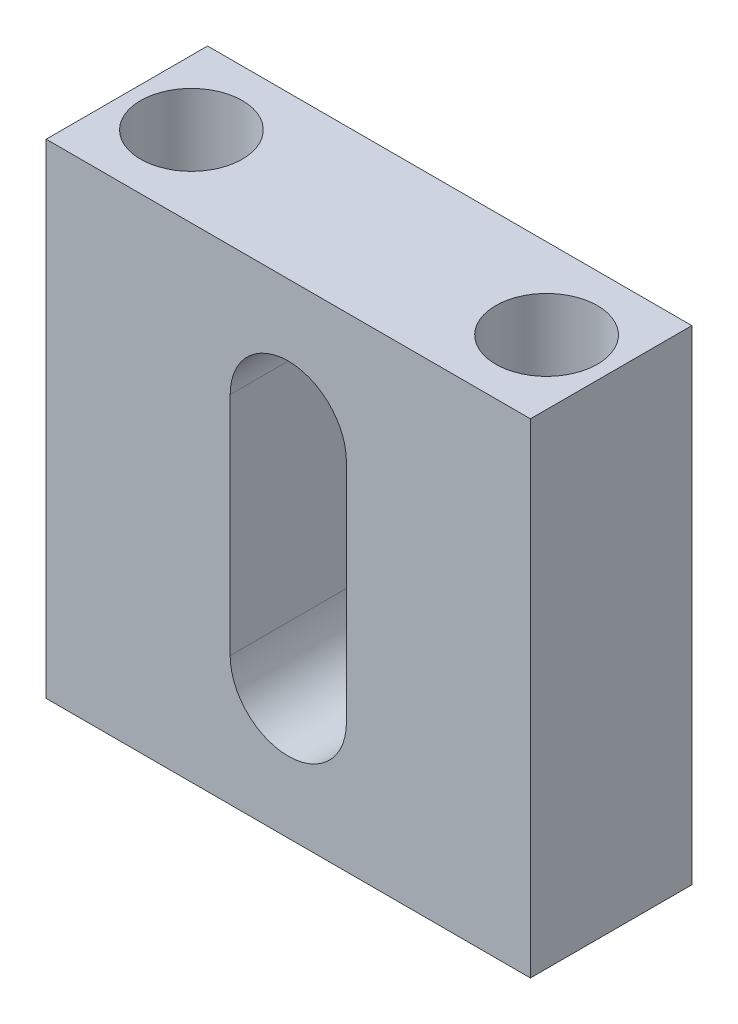
ISO-10303-21;
HEADER;
FILE_DESCRIPTION(('STEP AP214'),'2;1');
FILE_NAME('part.step','',(''),(''),'','','');
FILE_SCHEMA(('AUTOMOTIVE_DESIGN { 1 0 10303 214 1 1 1 1 }'));
ENDSEC;
DATA;
#1=APPLICATION_CONTEXT('core data for automotive mechanical design processes');
#2=APPLICATION_PROTOCOL_DEFINITION('international standard','automotive_design',2000,#1);
#3=PRODUCT_CONTEXT('',#1,'mechanical');
#4=PRODUCT('Part','Part','',(#3));
#5=PRODUCT_RELATED_PRODUCT_CATEGORY('part','',(#4));
#6=PRODUCT_DEFINITION_FORMATION('','',#4);
#7=PRODUCT_DEFINITION_CONTEXT('part definition',#1,'design');
#8=PRODUCT_DEFINITION('design','',#6,#7);
#9=PRODUCT_DEFINITION_SHAPE('','',#8);
#10=(LENGTH_UNIT() NAMED_UNIT(*) SI_UNIT(.MILLI.,.METRE.));
#11=(NAMED_UNIT(*) PLANE_ANGLE_UNIT() SI_UNIT($,.RADIAN.));
#12=(NAMED_UNIT(*) SI_UNIT($,.STERADIAN.) SOLID_ANGLE_UNIT());
#13=UNCERTAINTY_MEASURE_WITH_UNIT(LENGTH_MEASURE(1.E-05),#10,'distance_accuracy_value','');
#14=(GEOMETRIC_REPRESENTATION_CONTEXT(3) GLOBAL_UNCERTAINTY_ASSIGNED_CONTEXT((#13)) GLOBAL_UNIT_ASSIGNED_CONTEXT((#10,
#11,#12)) REPRESENTATION_CONTEXT('',''));
#15=CARTESIAN_POINT('',(0.,0.,0.));
#16=DIRECTION('',(0.,0.,1.));
#17=DIRECTION('',(1.,0.,0.));
#18=AXIS2_PLACEMENT_3D('',#15,#16,#17);
#19=CARTESIAN_POINT('',(0.,0.,6.34999999999999));
#20=DIRECTION('',(1.,0.,0.));
#21=DIRECTION('',(0.,0.,-1.));
#22=AXIS2_PLACEMENT_3D('',#19,#20,#21);
#23=PLANE('',#22);
#24=DIRECTION('',(0.,-1.,0.));
#25=VECTOR('',#24,1.);
#26=CARTESIAN_POINT('',(0.,0.,0.));
#27=LINE('',#26,#25);
#28=CARTESIAN_POINT('',(0.,19.05,0.));
#29=VERTEX_POINT('',#28);
#30=CARTESIAN_POINT('',(0.,0.,0.));
#31=VERTEX_POINT('',#30);
#32=EDGE_CURVE('E140',#29,#31,#27,.T.);
#33=ORIENTED_EDGE('',*,*,#32,.T.);
#34=DIRECTION('',(0.,0.,-1.));
#35=VECTOR('',#34,1.);
#36=CARTESIAN_POINT('',(0.,0.,6.34999999999999));
#37=LINE('',#36,#35);
#38=CARTESIAN_POINT('',(0.,0.,6.34999999999999));
#39=VERTEX_POINT('',#38);
#40=EDGE_CURVE('E11',#39,#31,#37,.T.);
#41=ORIENTED_EDGE('',*,*,#40,.F.);
#42=DIRECTION('',(0.,-1.,0.));
#43=VECTOR('',#42,1.);
#44=CARTESIAN_POINT('',(0.,0.,6.34999999999999));
#45=LINE('',#44,#43);
#46=CARTESIAN_POINT('',(0.,19.05,6.34999999999999));
#47=VERTEX_POINT('',#46);
#48=EDGE_CURVE('E149',#47,#39,#45,.T.);
#49=ORIENTED_EDGE('',*,*,#48,.F.);
#50=DIRECTION('',(0.,0.,-1.));
#51=VECTOR('',#50,1.);
#52=CARTESIAN_POINT('',(0.,19.05,6.34999999999999));
#53=LINE('',#52,#51);
#54=EDGE_CURVE('E159',#47,#29,#53,.T.);
#55=ORIENTED_EDGE('',*,*,#54,.T.);
#56=EDGE_LOOP('',(#33,#41,#49,#55));
#57=FACE_BOUND('',#56,.T.);
#58=ADVANCED_FACE('F36',(#57),#23,.F.);
#59=CARTESIAN_POINT('',(0.,0.,6.34999999999999));
#60=DIRECTION('',(0.,1.,0.));
#61=DIRECTION('',(0.,0.,1.));
#62=AXIS2_PLACEMENT_3D('',#59,#60,#61);
#63=PLANE('',#62);
#64=CARTESIAN_POINT('',(2.54,0.,3.175));
#65=DIRECTION('',(0.,-1.,0.));
#66=DIRECTION('',(0.,0.,-1.));
#67=AXIS2_PLACEMENT_3D('',#64,#65,#66);
#68=CIRCLE('',#67,2.);
#69=CARTESIAN_POINT('',(2.54,0.,1.175));
#70=VERTEX_POINT('',#69);
#71=EDGE_CURVE('E141',#70,#70,#68,.T.);
#72=ORIENTED_EDGE('',*,*,#71,.F.);
#73=EDGE_LOOP('',(#72));
#74=FACE_BOUND('',#73,.T.);
#75=CARTESIAN_POINT('',(16.51,0.,3.175));
#76=DIRECTION('',(0.,-1.,0.));
#77=DIRECTION('',(0.,0.,-1.));
#78=AXIS2_PLACEMENT_3D('',#75,#76,#77);
#79=CIRCLE('',#78,2.);
#80=CARTESIAN_POINT('',(16.51,0.,1.175));
#81=VERTEX_POINT('',#80);
#82=EDGE_CURVE('E133',#81,#81,#79,.T.);
#83=ORIENTED_EDGE('',*,*,#82,.F.);
#84=EDGE_LOOP('',(#83));
#85=FACE_BOUND('',#84,.T.);
#86=DIRECTION('',(1.,0.,0.));
#87=VECTOR('',#86,1.);
#88=CARTESIAN_POINT('',(0.,0.,0.));
#89=LINE('',#88,#87);
#90=CARTESIAN_POINT('',(19.05,0.,0.));
#91=VERTEX_POINT('',#90);
#92=EDGE_CURVE('E162',#31,#91,#89,.T.);
#93=ORIENTED_EDGE('',*,*,#92,.T.);
#94=DIRECTION('',(0.,0.,-1.));
#95=VECTOR('',#94,1.);
#96=CARTESIAN_POINT('',(19.05,0.,6.34999999999999));
#97=LINE('',#96,#95);
#98=CARTESIAN_POINT('',(19.05,0.,6.34999999999999));
#99=VERTEX_POINT('',#98);
#100=EDGE_CURVE('E43',#99,#91,#97,.T.);
#101=ORIENTED_EDGE('',*,*,#100,.F.);
#102=DIRECTION('',(1.,0.,0.));
#103=VECTOR('',#102,1.);
#104=CARTESIAN_POINT('',(0.,0.,6.34999999999999));
#105=LINE('',#104,#103);
#106=EDGE_CURVE('E152',#39,#99,#105,.T.);
#107=ORIENTED_EDGE('',*,*,#106,.F.);
#108=ORIENTED_EDGE('',*,*,#40,.T.);
#109=EDGE_LOOP('',(#93,#101,#107,#108));
#110=FACE_BOUND('',#109,.T.);
#111=ADVANCED_FACE('F190',(#74,#85,#110),#63,.F.);
#112=CARTESIAN_POINT('',(19.05,0.,6.34999999999999));
#113=DIRECTION('',(-1.,0.,0.));
#114=DIRECTION('',(0.,-1.,0.));
#115=AXIS2_PLACEMENT_3D('',#112,#113,#114);
#116=PLANE('',#115);
#117=DIRECTION('',(0.,1.,0.));
#118=VECTOR('',#117,1.);
#119=CARTESIAN_POINT('',(19.05,0.,0.));
#120=LINE('',#119,#118);
#121=CARTESIAN_POINT('',(19.05,19.05,0.));
#122=VERTEX_POINT('',#121);
#123=EDGE_CURVE('E164',#91,#122,#120,.T.);
#124=ORIENTED_EDGE('',*,*,#123,.T.);
#125=DIRECTION('',(0.,0.,-1.));
#126=VECTOR('',#125,1.);
#127=CARTESIAN_POINT('',(19.05,19.05,6.34999999999999));
#128=LINE('',#127,#126);
#129=CARTESIAN_POINT('',(19.05,19.05,6.34999999999999));
#130=VERTEX_POINT('',#129);
#131=EDGE_CURVE('E169',#130,#122,#128,.T.);
#132=ORIENTED_EDGE('',*,*,#131,.F.);
#133=DIRECTION('',(0.,1.,0.));
#134=VECTOR('',#133,1.);
#135=CARTESIAN_POINT('',(19.05,0.,6.34999999999999));
#136=LINE('',#135,#134);
#137=EDGE_CURVE('E155',#99,#130,#136,.T.);
#138=ORIENTED_EDGE('',*,*,#137,.F.);
#139=ORIENTED_EDGE('',*,*,#100,.T.);
#140=EDGE_LOOP('',(#124,#132,#138,#139));
#141=FACE_BOUND('',#140,.T.);
#142=ADVANCED_FACE('F176',(#141),#116,.F.);
#143=CARTESIAN_POINT('',(0.,19.05,6.34999999999999));
#144=DIRECTION('',(0.,-1.,0.));
#145=DIRECTION('',(0.,0.,-1.));
#146=AXIS2_PLACEMENT_3D('',#143,#144,#145);
#147=PLANE('',#146);
#148=CARTESIAN_POINT('',(2.54,19.05,3.175));
#149=DIRECTION('',(0.,-1.,0.));
#150=DIRECTION('',(0.,0.,-1.));
#151=AXIS2_PLACEMENT_3D('',#148,#149,#150);
#152=CIRCLE('',#151,2.);
#153=CARTESIAN_POINT('',(2.54,19.05,1.175));
#154=VERTEX_POINT('',#153);
#155=EDGE_CURVE('E137',#154,#154,#152,.T.);
#156=ORIENTED_EDGE('',*,*,#155,.T.);
#157=EDGE_LOOP('',(#156));
#158=FACE_BOUND('',#157,.T.);
#159=CARTESIAN_POINT('',(16.51,19.05,3.175));
#160=DIRECTION('',(0.,-1.,0.));
#161=DIRECTION('',(0.,0.,-1.));
#162=AXIS2_PLACEMENT_3D('',#159,#160,#161);
#163=CIRCLE('',#162,2.);
#164=CARTESIAN_POINT('',(16.51,19.05,1.175));
#165=VERTEX_POINT('',#164);
#166=EDGE_CURVE('E144',#165,#165,#163,.T.);
#167=ORIENTED_EDGE('',*,*,#166,.T.);
#168=EDGE_LOOP('',(#167));
#169=FACE_BOUND('',#168,.T.);
#170=DIRECTION('',(-1.,0.,0.));
#171=VECTOR('',#170,1.);
#172=CARTESIAN_POINT('',(0.,19.05,0.));
#173=LINE('',#172,#171);
#174=EDGE_CURVE('E153',#122,#29,#173,.T.);
#175=ORIENTED_EDGE('',*,*,#174,.T.);
#176=ORIENTED_EDGE('',*,*,#54,.F.);
#177=DIRECTION('',(-1.,0.,0.));
#178=VECTOR('',#177,1.);
#179=CARTESIAN_POINT('',(0.,19.05,6.34999999999999));
#180=LINE('',#179,#178);
#181=EDGE_CURVE('E157',#130,#47,#180,.T.);
#182=ORIENTED_EDGE('',*,*,#181,.F.);
#183=ORIENTED_EDGE('',*,*,#131,.T.);
#184=EDGE_LOOP('',(#175,#176,#182,#183));
#185=FACE_BOUND('',#184,.T.);
#186=ADVANCED_FACE('F183',(#158,#169,#185),#147,.F.);
#187=CARTESIAN_POINT('',(0.,0.,6.34999999999999));
#188=DIRECTION('',(0.,0.,-1.));
#189=DIRECTION('',(-1.,0.,0.));
#190=AXIS2_PLACEMENT_3D('',#187,#188,#189);
#191=PLANE('',#190);
#192=DIRECTION('',(0.,-1.,0.));
#193=VECTOR('',#192,1.);
#194=CARTESIAN_POINT('',(7.239,0.,6.34999999999999));
#195=LINE('',#194,#193);
#196=CARTESIAN_POINT('',(7.239,13.97,6.34999999999999));
#197=VERTEX_POINT('',#196);
#198=CARTESIAN_POINT('',(7.239,5.08,6.34999999999999));
#199=VERTEX_POINT('',#198);
#200=EDGE_CURVE('E127',#197,#199,#195,.T.);
#201=ORIENTED_EDGE('',*,*,#200,.F.);
#202=CARTESIAN_POINT('',(9.525,13.97,6.34999999999999));
#203=DIRECTION('',(0.,0.,1.));
#204=DIRECTION('',(1.,0.,0.));
#205=AXIS2_PLACEMENT_3D('',#202,#203,#204);
#206=CIRCLE('',#205,2.286);
#207=CARTESIAN_POINT('',(11.811,13.97,6.34999999999999));
#208=VERTEX_POINT('',#207);
#209=EDGE_CURVE('E50',#208,#197,#206,.T.);
#210=ORIENTED_EDGE('',*,*,#209,.F.);
#211=DIRECTION('',(0.,-1.,0.));
#212=VECTOR('',#211,1.);
#213=CARTESIAN_POINT('',(11.811,0.,6.34999999999999));
#214=LINE('',#213,#212);
#215=CARTESIAN_POINT('',(11.811,5.08,6.34999999999999));
#216=VERTEX_POINT('',#215);
#217=EDGE_CURVE('E118',#208,#216,#214,.T.);
#218=ORIENTED_EDGE('',*,*,#217,.T.);
#219=CARTESIAN_POINT('',(9.525,5.08,6.34999999999999));
#220=DIRECTION('',(0.,0.,1.));
#221=DIRECTION('',(1.,0.,0.));
#222=AXIS2_PLACEMENT_3D('',#219,#220,#221);
#223=CIRCLE('',#222,2.286);
#224=EDGE_CURVE('E121',#199,#216,#223,.T.);
#225=ORIENTED_EDGE('',*,*,#224,.F.);
#226=EDGE_LOOP('',(#201,#210,#218,#225));
#227=FACE_BOUND('',#226,.T.);
#228=ORIENTED_EDGE('',*,*,#48,.T.);
#229=ORIENTED_EDGE('',*,*,#106,.T.);
#230=ORIENTED_EDGE('',*,*,#137,.T.);
#231=ORIENTED_EDGE('',*,*,#181,.T.);
#232=EDGE_LOOP('',(#228,#229,#230,#231));
#233=FACE_BOUND('',#232,.T.);
#234=ADVANCED_FACE('F189',(#227,#233),#191,.F.);
#235=CARTESIAN_POINT('',(0.,0.,0.));
#236=DIRECTION('',(0.,0.,-1.));
#237=DIRECTION('',(-1.,0.,0.));
#238=AXIS2_PLACEMENT_3D('',#235,#236,#237);
#239=PLANE('',#238);
#240=CARTESIAN_POINT('',(9.525,13.97,0.));
#241=DIRECTION('',(0.,0.,1.));
#242=DIRECTION('',(1.,0.,0.));
#243=AXIS2_PLACEMENT_3D('',#240,#241,#242);
#244=CIRCLE('',#243,2.286);
#245=CARTESIAN_POINT('',(11.811,13.97,0.));
#246=VERTEX_POINT('',#245);
#247=CARTESIAN_POINT('',(7.239,13.97,0.));
#248=VERTEX_POINT('',#247);
#249=EDGE_CURVE('E103',#246,#248,#244,.T.);
#250=ORIENTED_EDGE('',*,*,#249,.T.);
#251=DIRECTION('',(0.,-1.,0.));
#252=VECTOR('',#251,1.);
#253=CARTESIAN_POINT('',(7.239,0.,0.));
#254=LINE('',#253,#252);
#255=CARTESIAN_POINT('',(7.239,5.08,0.));
#256=VERTEX_POINT('',#255);
#257=EDGE_CURVE('E112',#248,#256,#254,.T.);
#258=ORIENTED_EDGE('',*,*,#257,.T.);
#259=CARTESIAN_POINT('',(9.525,5.08,0.));
#260=DIRECTION('',(0.,0.,1.));
#261=DIRECTION('',(1.,0.,0.));
#262=AXIS2_PLACEMENT_3D('',#259,#260,#261);
#263=CIRCLE('',#262,2.286);
#264=CARTESIAN_POINT('',(11.811,5.08,0.));
#265=VERTEX_POINT('',#264);
#266=EDGE_CURVE('E58',#256,#265,#263,.T.);
#267=ORIENTED_EDGE('',*,*,#266,.T.);
#268=DIRECTION('',(0.,-1.,0.));
#269=VECTOR('',#268,1.);
#270=CARTESIAN_POINT('',(11.811,0.,0.));
#271=LINE('',#270,#269);
#272=EDGE_CURVE('E109',#246,#265,#271,.T.);
#273=ORIENTED_EDGE('',*,*,#272,.F.);
#274=EDGE_LOOP('',(#250,#258,#267,#273));
#275=FACE_BOUND('',#274,.T.);
#276=ORIENTED_EDGE('',*,*,#32,.F.);
#277=ORIENTED_EDGE('',*,*,#174,.F.);
#278=ORIENTED_EDGE('',*,*,#123,.F.);
#279=ORIENTED_EDGE('',*,*,#92,.F.);
#280=EDGE_LOOP('',(#276,#277,#278,#279));
#281=FACE_BOUND('',#280,.T.);
#282=ADVANCED_FACE('F116',(#275,#281),#239,.T.);
#283=CARTESIAN_POINT('',(16.51,19.05,3.175));
#284=DIRECTION('',(0.,-1.,0.));
#285=DIRECTION('',(0.,0.,-1.));
#286=AXIS2_PLACEMENT_3D('',#283,#284,#285);
#287=CYLINDRICAL_SURFACE('',#286,2.);
#288=CARTESIAN_POINT('',(16.51,19.05,1.175));
#289=CARTESIAN_POINT('',(16.51,18.8515625,1.175));
#290=CARTESIAN_POINT('',(16.51,18.653125,1.175));
#291=CARTESIAN_POINT('',(16.51,18.25625,1.175));
#292=CARTESIAN_POINT('',(16.51,18.0578125,1.175));
#293=CARTESIAN_POINT('',(16.51,17.6609375,1.175));
#294=CARTESIAN_POINT('',(16.51,17.4625,1.175));
#295=CARTESIAN_POINT('',(16.51,17.065625,1.175));
#296=CARTESIAN_POINT('',(16.51,16.8671875,1.175));
#297=CARTESIAN_POINT('',(16.51,16.4703125,1.175));
#298=CARTESIAN_POINT('',(16.51,16.271875,1.175));
#299=CARTESIAN_POINT('',(16.51,15.875,1.175));
#300=CARTESIAN_POINT('',(16.51,15.6765625,1.175));
#301=CARTESIAN_POINT('',(16.51,15.2796875,1.175));
#302=CARTESIAN_POINT('',(16.51,15.08125,1.175));
#303=CARTESIAN_POINT('',(16.51,14.684375,1.175));
#304=CARTESIAN_POINT('',(16.51,14.4859375,1.175));
#305=CARTESIAN_POINT('',(16.51,14.0890625,1.175));
#306=CARTESIAN_POINT('',(16.51,13.890625,1.175));
#307=CARTESIAN_POINT('',(16.51,13.49375,1.175));
#308=CARTESIAN_POINT('',(16.51,13.2953125,1.175));
#309=CARTESIAN_POINT('',(16.51,12.8984375,1.175));
#310=CARTESIAN_POINT('',(16.51,12.7,1.175));
#311=CARTESIAN_POINT('',(16.51,12.303125,1.175));
#312=CARTESIAN_POINT('',(16.51,12.1046875,1.175));
#313=CARTESIAN_POINT('',(16.51,11.7078125,1.175));
#314=CARTESIAN_POINT('',(16.51,11.509375,1.175));
#315=CARTESIAN_POINT('',(16.51,11.1125,1.175));
#316=CARTESIAN_POINT('',(16.51,10.9140625,1.175));
#317=CARTESIAN_POINT('',(16.51,10.5171875,1.175));
#318=CARTESIAN_POINT('',(16.51,10.31875,1.175));
#319=CARTESIAN_POINT('',(16.51,9.92187500000001,1.175));
#320=CARTESIAN_POINT('',(16.51,9.72343750000001,1.175));
#321=CARTESIAN_POINT('',(16.51,9.32656250000001,1.175));
#322=CARTESIAN_POINT('',(16.51,9.12812500000001,1.175));
#323=CARTESIAN_POINT('',(16.51,8.73125000000001,1.175));
#324=CARTESIAN_POINT('',(16.51,8.53281250000001,1.175));
#325=CARTESIAN_POINT('',(16.51,8.13593750000001,1.175));
#326=CARTESIAN_POINT('',(16.51,7.93750000000001,1.175));
#327=CARTESIAN_POINT('',(16.51,7.54062500000001,1.175));
#328=CARTESIAN_POINT('',(16.51,7.34218750000001,1.175));
#329=CARTESIAN_POINT('',(16.51,6.94531250000001,1.175));
#330=CARTESIAN_POINT('',(16.51,6.74687500000001,1.175));
#331=CARTESIAN_POINT('',(16.51,6.35000000000001,1.175));
#332=CARTESIAN_POINT('',(16.51,6.15156250000001,1.175));
#333=CARTESIAN_POINT('',(16.51,5.75468750000001,1.175));
#334=CARTESIAN_POINT('',(16.51,5.55625000000001,1.175));
#335=CARTESIAN_POINT('',(16.51,5.15937500000001,1.175));
#336=CARTESIAN_POINT('',(16.51,4.96093750000001,1.175));
#337=CARTESIAN_POINT('',(16.51,4.56406250000001,1.175));
#338=CARTESIAN_POINT('',(16.51,4.36562500000001,1.175));
#339=CARTESIAN_POINT('',(16.51,3.96875000000001,1.175));
#340=CARTESIAN_POINT('',(16.51,3.77031250000001,1.175));
#341=CARTESIAN_POINT('',(16.51,3.37343750000001,1.175));
#342=CARTESIAN_POINT('',(16.51,3.17500000000001,1.175));
#343=CARTESIAN_POINT('',(16.51,2.77812500000001,1.175));
#344=CARTESIAN_POINT('',(16.51,2.57968750000001,1.175));
#345=CARTESIAN_POINT('',(16.51,2.1828125,1.175));
#346=CARTESIAN_POINT('',(16.51,1.984375,1.175));
#347=CARTESIAN_POINT('',(16.51,1.5875,1.175));
#348=CARTESIAN_POINT('',(16.51,1.3890625,1.175));
#349=CARTESIAN_POINT('',(16.51,0.992187500000004,1.175));
#350=CARTESIAN_POINT('',(16.51,0.793750000000004,1.175));
#351=CARTESIAN_POINT('',(16.51,0.396875000000004,1.175));
#352=CARTESIAN_POINT('',(16.51,0.198437500000004,1.175));
#353=CARTESIAN_POINT('',(16.51,0.,1.175));
#354=B_SPLINE_CURVE_WITH_KNOTS('',3,(#288,#289,#290,#291,#292,#293,#294,#295,#296,#297,#298,
#299,#300,#301,#302,#303,#304,#305,#306,#307,#308,#309,#310,#311,#312,#313,#314,#315,#316,#317,
#318,#319,#320,#321,#322,#323,#324,#325,#326,#327,#328,#329,#330,#331,#332,#333,#334,#335,#336,
#337,#338,#339,#340,#341,#342,#343,#344,#345,#346,#347,#348,#349,#350,#351,#352,#353),
.UNSPECIFIED.,.F.,.F.,(4,2,2,2,2,2,2,2,2,2,2,2,2,2,2,2,2,2,2,2,2,2,2,2,2,2,2,2,2,2,2,2,4),(0.,
0.595312499999997,1.190625,1.7859375,2.38125,2.9765625,3.571875,4.1671875,4.7625,5.3578125,
5.953125,6.5484375,7.14375,7.7390625,8.334375,8.9296875,9.525,10.1203125,10.715625,11.3109375,
11.90625,12.5015625,13.096875,13.6921875,14.2875,14.8828125,15.478125,16.0734375,16.66875,
17.2640625,17.859375,18.4546875,19.05),.UNSPECIFIED.);
#355=EDGE_CURVE('BSEAM206',#165,#81,#354,.T.);
#356=ORIENTED_EDGE('',*,*,#166,.F.);
#357=ORIENTED_EDGE('',*,*,#82,.T.);
#358=ORIENTED_EDGE('',*,*,#355,.T.);
#359=ORIENTED_EDGE('',*,*,#355,.F.);
#360=EDGE_LOOP('',(#356,#358,#357,#359));
#361=FACE_BOUND('',#360,.T.);
#362=ADVANCED_FACE('F206',(#361),#287,.F.);
#363=CARTESIAN_POINT('',(2.54,19.05,3.175));
#364=DIRECTION('',(0.,-1.,0.));
#365=DIRECTION('',(0.,0.,-1.));
#366=AXIS2_PLACEMENT_3D('',#363,#364,#365);
#367=CYLINDRICAL_SURFACE('',#366,2.);
#368=CARTESIAN_POINT('',(2.54,19.05,1.175));
#369=CARTESIAN_POINT('',(2.54,18.8515625,1.175));
#370=CARTESIAN_POINT('',(2.54,18.653125,1.175));
#371=CARTESIAN_POINT('',(2.54,18.25625,1.175));
#372=CARTESIAN_POINT('',(2.54,18.0578125,1.175));
#373=CARTESIAN_POINT('',(2.54,17.6609375,1.175));
#374=CARTESIAN_POINT('',(2.54,17.4625,1.175));
#375=CARTESIAN_POINT('',(2.54,17.065625,1.175));
#376=CARTESIAN_POINT('',(2.54,16.8671875,1.175));
#377=CARTESIAN_POINT('',(2.54,16.4703125,1.175));
#378=CARTESIAN_POINT('',(2.54,16.271875,1.175));
#379=CARTESIAN_POINT('',(2.54,15.875,1.175));
#380=CARTESIAN_POINT('',(2.54,15.6765625,1.175));
#381=CARTESIAN_POINT('',(2.54,15.2796875,1.175));
#382=CARTESIAN_POINT('',(2.54,15.08125,1.175));
#383=CARTESIAN_POINT('',(2.54,14.684375,1.175));
#384=CARTESIAN_POINT('',(2.54,14.4859375,1.175));
#385=CARTESIAN_POINT('',(2.54,14.0890625,1.175));
#386=CARTESIAN_POINT('',(2.54,13.890625,1.175));
#387=CARTESIAN_POINT('',(2.54,13.49375,1.175));
#388=CARTESIAN_POINT('',(2.54,13.2953125,1.175));
#389=CARTESIAN_POINT('',(2.54,12.8984375,1.175));
#390=CARTESIAN_POINT('',(2.54,12.7,1.175));
#391=CARTESIAN_POINT('',(2.54,12.303125,1.175));
#392=CARTESIAN_POINT('',(2.54,12.1046875,1.175));
#393=CARTESIAN_POINT('',(2.54,11.7078125,1.175));
#394=CARTESIAN_POINT('',(2.54,11.509375,1.175));
#395=CARTESIAN_POINT('',(2.54,11.1125,1.175));
#396=CARTESIAN_POINT('',(2.54,10.9140625,1.175));
#397=CARTESIAN_POINT('',(2.54,10.5171875,1.175));
#398=CARTESIAN_POINT('',(2.54,10.31875,1.175));
#399=CARTESIAN_POINT('',(2.54,9.92187500000001,1.175));
#400=CARTESIAN_POINT('',(2.54,9.72343750000001,1.175));
#401=CARTESIAN_POINT('',(2.54,9.32656250000001,1.175));
#402=CARTESIAN_POINT('',(2.54,9.12812500000001,1.175));
#403=CARTESIAN_POINT('',(2.54,8.73125000000001,1.175));
#404=CARTESIAN_POINT('',(2.54,8.53281250000001,1.175));
#405=CARTESIAN_POINT('',(2.54,8.13593750000001,1.175));
#406=CARTESIAN_POINT('',(2.54,7.93750000000001,1.175));
#407=CARTESIAN_POINT('',(2.54,7.54062500000001,1.175));
#408=CARTESIAN_POINT('',(2.54,7.34218750000001,1.175));
#409=CARTESIAN_POINT('',(2.54,6.94531250000001,1.175));
#410=CARTESIAN_POINT('',(2.54,6.74687500000001,1.175));
#411=CARTESIAN_POINT('',(2.54,6.35000000000001,1.175));
#412=CARTESIAN_POINT('',(2.54,6.15156250000001,1.175));
#413=CARTESIAN_POINT('',(2.54,5.75468750000001,1.175));
#414=CARTESIAN_POINT('',(2.54,5.55625000000001,1.175));
#415=CARTESIAN_POINT('',(2.54,5.15937500000001,1.175));
#416=CARTESIAN_POINT('',(2.54,4.96093750000001,1.175));
#417=CARTESIAN_POINT('',(2.54,4.56406250000001,1.175));
#418=CARTESIAN_POINT('',(2.54,4.36562500000001,1.175));
#419=CARTESIAN_POINT('',(2.54,3.96875000000001,1.175));
#420=CARTESIAN_POINT('',(2.54,3.77031250000001,1.175));
#421=CARTESIAN_POINT('',(2.54,3.37343750000001,1.175));
#422=CARTESIAN_POINT('',(2.54,3.17500000000001,1.175));
#423=CARTESIAN_POINT('',(2.54,2.77812500000001,1.175));
#424=CARTESIAN_POINT('',(2.54,2.57968750000001,1.175));
#425=CARTESIAN_POINT('',(2.54,2.1828125,1.175));
#426=CARTESIAN_POINT('',(2.54,1.984375,1.175));
#427=CARTESIAN_POINT('',(2.54,1.5875,1.175));
#428=CARTESIAN_POINT('',(2.54,1.3890625,1.175));
#429=CARTESIAN_POINT('',(2.54,0.992187500000004,1.175));
#430=CARTESIAN_POINT('',(2.54,0.793750000000004,1.175));
#431=CARTESIAN_POINT('',(2.54,0.396875000000004,1.175));
#432=CARTESIAN_POINT('',(2.54,0.198437500000004,1.175));
#433=CARTESIAN_POINT('',(2.54,0.,1.175));
#434=B_SPLINE_CURVE_WITH_KNOTS('',3,(#368,#369,#370,#371,#372,#373,#374,#375,#376,#377,#378,
#379,#380,#381,#382,#383,#384,#385,#386,#387,#388,#389,#390,#391,#392,#393,#394,#395,#396,#397,
#398,#399,#400,#401,#402,#403,#404,#405,#406,#407,#408,#409,#410,#411,#412,#413,#414,#415,#416,
#417,#418,#419,#420,#421,#422,#423,#424,#425,#426,#427,#428,#429,#430,#431,#432,#433),
.UNSPECIFIED.,.F.,.F.,(4,2,2,2,2,2,2,2,2,2,2,2,2,2,2,2,2,2,2,2,2,2,2,2,2,2,2,2,2,2,2,2,4),(0.,
0.595312499999997,1.190625,1.7859375,2.38125,2.9765625,3.571875,4.1671875,4.7625,5.3578125,
5.953125,6.5484375,7.14375,7.7390625,8.334375,8.9296875,9.525,10.1203125,10.715625,11.3109375,
11.90625,12.5015625,13.096875,13.6921875,14.2875,14.8828125,15.478125,16.0734375,16.66875,
17.2640625,17.859375,18.4546875,19.05),.UNSPECIFIED.);
#435=EDGE_CURVE('BSEAM212',#154,#70,#434,.T.);
#436=ORIENTED_EDGE('',*,*,#155,.F.);
#437=ORIENTED_EDGE('',*,*,#71,.T.);
#438=ORIENTED_EDGE('',*,*,#435,.T.);
#439=ORIENTED_EDGE('',*,*,#435,.F.);
#440=EDGE_LOOP('',(#436,#438,#437,#439));
#441=FACE_BOUND('',#440,.T.);
#442=ADVANCED_FACE('F212',(#441),#367,.F.);
#443=CARTESIAN_POINT('',(9.525,13.97,0.));
#444=DIRECTION('',(0.,0.,1.));
#445=DIRECTION('',(1.,0.,0.));
#446=AXIS2_PLACEMENT_3D('',#443,#444,#445);
#447=CYLINDRICAL_SURFACE('',#446,2.286);
#448=ORIENTED_EDGE('',*,*,#209,.T.);
#449=DIRECTION('',(0.,0.,1.));
#450=VECTOR('',#449,1.);
#451=CARTESIAN_POINT('',(7.239,13.97,0.));
#452=LINE('',#451,#450);
#453=EDGE_CURVE('E99',#248,#197,#452,.T.);
#454=ORIENTED_EDGE('',*,*,#453,.F.);
#455=ORIENTED_EDGE('',*,*,#249,.F.);
#456=DIRECTION('',(0.,0.,1.));
#457=VECTOR('',#456,1.);
#458=CARTESIAN_POINT('',(11.811,13.97,0.));
#459=LINE('',#458,#457);
#460=EDGE_CURVE('E131',#246,#208,#459,.T.);
#461=ORIENTED_EDGE('',*,*,#460,.T.);
#462=EDGE_LOOP('',(#448,#454,#455,#461));
#463=FACE_BOUND('',#462,.T.);
#464=ADVANCED_FACE('F101',(#463),#447,.F.);
#465=CARTESIAN_POINT('',(11.811,0.,0.));
#466=DIRECTION('',(-1.,0.,0.));
#467=DIRECTION('',(0.,0.,1.));
#468=AXIS2_PLACEMENT_3D('',#465,#466,#467);
#469=PLANE('',#468);
#470=ORIENTED_EDGE('',*,*,#217,.F.);
#471=ORIENTED_EDGE('',*,*,#460,.F.);
#472=ORIENTED_EDGE('',*,*,#272,.T.);
#473=DIRECTION('',(0.,0.,1.));
#474=VECTOR('',#473,1.);
#475=CARTESIAN_POINT('',(11.811,5.08,0.));
#476=LINE('',#475,#474);
#477=EDGE_CURVE('E134',#265,#216,#476,.T.);
#478=ORIENTED_EDGE('',*,*,#477,.T.);
#479=EDGE_LOOP('',(#470,#471,#472,#478));
#480=FACE_BOUND('',#479,.T.);
#481=ADVANCED_FACE('F219',(#480),#469,.T.);
#482=CARTESIAN_POINT('',(9.525,5.08,0.));
#483=DIRECTION('',(0.,0.,1.));
#484=DIRECTION('',(1.,0.,0.));
#485=AXIS2_PLACEMENT_3D('',#482,#483,#484);
#486=CYLINDRICAL_SURFACE('',#485,2.286);
#487=ORIENTED_EDGE('',*,*,#224,.T.);
#488=ORIENTED_EDGE('',*,*,#477,.F.);
#489=ORIENTED_EDGE('',*,*,#266,.F.);
#490=DIRECTION('',(0.,0.,1.));
#491=VECTOR('',#490,1.);
#492=CARTESIAN_POINT('',(7.239,5.08,0.));
#493=LINE('',#492,#491);
#494=EDGE_CURVE('E108',#256,#199,#493,.T.);
#495=ORIENTED_EDGE('',*,*,#494,.T.);
#496=EDGE_LOOP('',(#487,#488,#489,#495));
#497=FACE_BOUND('',#496,.T.);
#498=ADVANCED_FACE('F222',(#497),#486,.F.);
#499=CARTESIAN_POINT('',(7.239,0.,0.));
#500=DIRECTION('',(-1.,0.,0.));
#501=DIRECTION('',(0.,-1.,0.));
#502=AXIS2_PLACEMENT_3D('',#499,#500,#501);
#503=PLANE('',#502);
#504=ORIENTED_EDGE('',*,*,#200,.T.);
#505=ORIENTED_EDGE('',*,*,#494,.F.);
#506=ORIENTED_EDGE('',*,*,#257,.F.);
#507=ORIENTED_EDGE('',*,*,#453,.T.);
#508=EDGE_LOOP('',(#504,#505,#506,#507));
#509=FACE_BOUND('',#508,.T.);
#510=ADVANCED_FACE('F113',(#509),#503,.F.);
#511=CLOSED_SHELL('',(#58,#111,#142,#186,#234,#282,#362,#442,#464,#481,#498,#510));
#512=MANIFOLD_SOLID_BREP('B2',#511);
#513=ADVANCED_BREP_SHAPE_REPRESENTATION('',(#18,#512),#14);
#514=SHAPE_DEFINITION_REPRESENTATION(#9,#513);
ENDSEC;
END-ISO-10303-21;
